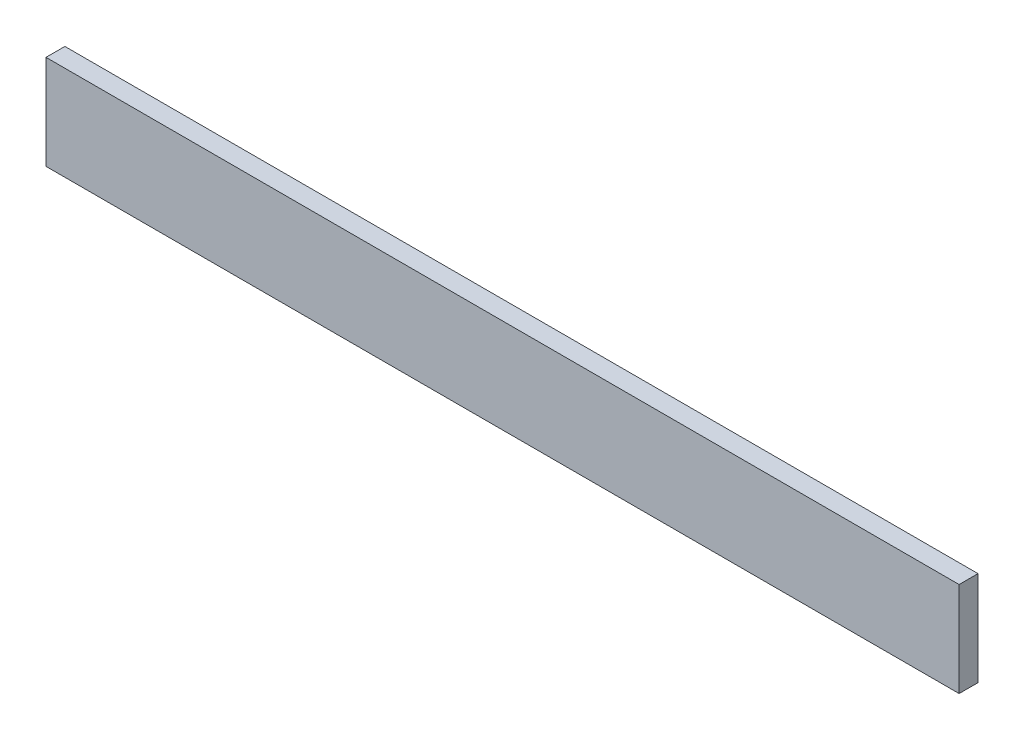
ISO-10303-21;
HEADER;
FILE_DESCRIPTION(('STEP AP214'),'2;1');
FILE_NAME('part.step','',(''),(''),'','','');
FILE_SCHEMA(('AUTOMOTIVE_DESIGN { 1 0 10303 214 1 1 1 1 }'));
ENDSEC;
DATA;
#1=APPLICATION_CONTEXT('core data for automotive mechanical design processes');
#2=APPLICATION_PROTOCOL_DEFINITION('international standard','automotive_design',2000,#1);
#3=PRODUCT_CONTEXT('',#1,'mechanical');
#4=PRODUCT('Part','Part','',(#3));
#5=PRODUCT_RELATED_PRODUCT_CATEGORY('part','',(#4));
#6=PRODUCT_DEFINITION_FORMATION('','',#4);
#7=PRODUCT_DEFINITION_CONTEXT('part definition',#1,'design');
#8=PRODUCT_DEFINITION('design','',#6,#7);
#9=PRODUCT_DEFINITION_SHAPE('','',#8);
#10=(LENGTH_UNIT() NAMED_UNIT(*) SI_UNIT(.MILLI.,.METRE.));
#11=(NAMED_UNIT(*) PLANE_ANGLE_UNIT() SI_UNIT($,.RADIAN.));
#12=(NAMED_UNIT(*) SI_UNIT($,.STERADIAN.) SOLID_ANGLE_UNIT());
#13=UNCERTAINTY_MEASURE_WITH_UNIT(LENGTH_MEASURE(1.E-05),#10,'distance_accuracy_value','');
#14=(GEOMETRIC_REPRESENTATION_CONTEXT(3) GLOBAL_UNCERTAINTY_ASSIGNED_CONTEXT((#13)) GLOBAL_UNIT_ASSIGNED_CONTEXT((#10,
#11,#12)) REPRESENTATION_CONTEXT('',''));
#15=CARTESIAN_POINT('',(0.,0.,0.));
#16=DIRECTION('',(0.,0.,1.));
#17=DIRECTION('',(1.,0.,0.));
#18=AXIS2_PLACEMENT_3D('',#15,#16,#17);
#19=CARTESIAN_POINT('',(39.6216819724826,39.0353646252086,118.017510674416));
#20=DIRECTION('',(-1.,0.,0.));
#21=DIRECTION('',(0.,0.,1.));
#22=AXIS2_PLACEMENT_3D('',#19,#20,#21);
#23=PLANE('',#22);
#24=DIRECTION('',(0.,-1.,0.));
#25=VECTOR('',#24,1.);
#26=CARTESIAN_POINT('',(39.6216819724826,39.0353646252086,120.017510674416));
#27=LINE('',#26,#25);
#28=CARTESIAN_POINT('',(39.6216819724826,39.0353646252086,120.017510674416));
#29=VERTEX_POINT('',#28);
#30=CARTESIAN_POINT('',(39.6216819724826,29.0353646252086,120.017510674416));
#31=VERTEX_POINT('',#30);
#32=EDGE_CURVE('E97',#29,#31,#27,.T.);
#33=ORIENTED_EDGE('',*,*,#32,.T.);
#34=DIRECTION('',(0.,0.,1.));
#35=VECTOR('',#34,1.);
#36=CARTESIAN_POINT('',(39.6216819724826,29.0353646252086,118.017510674416));
#37=LINE('',#36,#35);
#38=CARTESIAN_POINT('',(39.6216819724826,29.0353646252086,118.017510674416));
#39=VERTEX_POINT('',#38);
#40=EDGE_CURVE('E11',#39,#31,#37,.T.);
#41=ORIENTED_EDGE('',*,*,#40,.F.);
#42=DIRECTION('',(0.,-1.,0.));
#43=VECTOR('',#42,1.);
#44=CARTESIAN_POINT('',(39.6216819724826,39.0353646252086,118.017510674416));
#45=LINE('',#44,#43);
#46=CARTESIAN_POINT('',(39.6216819724826,39.0353646252086,118.017510674416));
#47=VERTEX_POINT('',#46);
#48=EDGE_CURVE('E85',#47,#39,#45,.T.);
#49=ORIENTED_EDGE('',*,*,#48,.F.);
#50=DIRECTION('',(0.,0.,1.));
#51=VECTOR('',#50,1.);
#52=CARTESIAN_POINT('',(39.6216819724826,39.0353646252086,118.017510674416));
#53=LINE('',#52,#51);
#54=EDGE_CURVE('E93',#47,#29,#53,.T.);
#55=ORIENTED_EDGE('',*,*,#54,.T.);
#56=EDGE_LOOP('',(#33,#41,#49,#55));
#57=FACE_BOUND('',#56,.T.);
#58=ADVANCED_FACE('F34',(#57),#23,.F.);
#59=CARTESIAN_POINT('',(39.6216819724826,29.0353646252086,118.017510674416));
#60=DIRECTION('',(0.,1.,0.));
#61=DIRECTION('',(0.,0.,1.));
#62=AXIS2_PLACEMENT_3D('',#59,#60,#61);
#63=PLANE('',#62);
#64=DIRECTION('',(-1.,0.,0.));
#65=VECTOR('',#64,1.);
#66=CARTESIAN_POINT('',(39.6216819724826,29.0353646252086,120.017510674416));
#67=LINE('',#66,#65);
#68=CARTESIAN_POINT('',(-57.0531592771973,29.0353646252086,120.017510674416));
#69=VERTEX_POINT('',#68);
#70=EDGE_CURVE('E89',#31,#69,#67,.T.);
#71=ORIENTED_EDGE('',*,*,#70,.T.);
#72=DIRECTION('',(0.,0.,1.));
#73=VECTOR('',#72,1.);
#74=CARTESIAN_POINT('',(-57.0531592771973,29.0353646252086,118.017510674416));
#75=LINE('',#74,#73);
#76=CARTESIAN_POINT('',(-57.0531592771973,29.0353646252086,118.017510674416));
#77=VERTEX_POINT('',#76);
#78=EDGE_CURVE('E42',#77,#69,#75,.T.);
#79=ORIENTED_EDGE('',*,*,#78,.F.);
#80=DIRECTION('',(-1.,0.,0.));
#81=VECTOR('',#80,1.);
#82=CARTESIAN_POINT('',(39.6216819724826,29.0353646252086,118.017510674416));
#83=LINE('',#82,#81);
#84=EDGE_CURVE('E80',#39,#77,#83,.T.);
#85=ORIENTED_EDGE('',*,*,#84,.F.);
#86=ORIENTED_EDGE('',*,*,#40,.T.);
#87=EDGE_LOOP('',(#71,#79,#85,#86));
#88=FACE_BOUND('',#87,.T.);
#89=ADVANCED_FACE('F88',(#88),#63,.F.);
#90=CARTESIAN_POINT('',(-57.0531592771973,39.0353646252086,118.017510674416));
#91=DIRECTION('',(1.,0.,0.));
#92=DIRECTION('',(0.,0.,-1.));
#93=AXIS2_PLACEMENT_3D('',#90,#91,#92);
#94=PLANE('',#93);
#95=DIRECTION('',(0.,1.,0.));
#96=VECTOR('',#95,1.);
#97=CARTESIAN_POINT('',(-57.0531592771973,39.0353646252086,120.017510674416));
#98=LINE('',#97,#96);
#99=CARTESIAN_POINT('',(-57.0531592771973,39.0353646252086,120.017510674416));
#100=VERTEX_POINT('',#99);
#101=EDGE_CURVE('E67',#69,#100,#98,.T.);
#102=ORIENTED_EDGE('',*,*,#101,.T.);
#103=DIRECTION('',(0.,0.,1.));
#104=VECTOR('',#103,1.);
#105=CARTESIAN_POINT('',(-57.0531592771973,39.0353646252086,118.017510674416));
#106=LINE('',#105,#104);
#107=CARTESIAN_POINT('',(-57.0531592771973,39.0353646252086,118.017510674416));
#108=VERTEX_POINT('',#107);
#109=EDGE_CURVE('E90',#108,#100,#106,.T.);
#110=ORIENTED_EDGE('',*,*,#109,.F.);
#111=DIRECTION('',(0.,1.,0.));
#112=VECTOR('',#111,1.);
#113=CARTESIAN_POINT('',(-57.0531592771973,39.0353646252086,118.017510674416));
#114=LINE('',#113,#112);
#115=EDGE_CURVE('E83',#77,#108,#114,.T.);
#116=ORIENTED_EDGE('',*,*,#115,.F.);
#117=ORIENTED_EDGE('',*,*,#78,.T.);
#118=EDGE_LOOP('',(#102,#110,#116,#117));
#119=FACE_BOUND('',#118,.T.);
#120=ADVANCED_FACE('F91',(#119),#94,.F.);
#121=CARTESIAN_POINT('',(39.6216819724826,39.0353646252086,118.017510674416));
#122=DIRECTION('',(0.,-1.,0.));
#123=DIRECTION('',(0.,0.,-1.));
#124=AXIS2_PLACEMENT_3D('',#121,#122,#123);
#125=PLANE('',#124);
#126=DIRECTION('',(1.,0.,0.));
#127=VECTOR('',#126,1.);
#128=CARTESIAN_POINT('',(39.6216819724826,39.0353646252086,120.017510674416));
#129=LINE('',#128,#127);
#130=EDGE_CURVE('E73',#100,#29,#129,.T.);
#131=ORIENTED_EDGE('',*,*,#130,.T.);
#132=ORIENTED_EDGE('',*,*,#54,.F.);
#133=DIRECTION('',(1.,0.,0.));
#134=VECTOR('',#133,1.);
#135=CARTESIAN_POINT('',(39.6216819724826,39.0353646252086,118.017510674416));
#136=LINE('',#135,#134);
#137=EDGE_CURVE('E50',#108,#47,#136,.T.);
#138=ORIENTED_EDGE('',*,*,#137,.F.);
#139=ORIENTED_EDGE('',*,*,#109,.T.);
#140=EDGE_LOOP('',(#131,#132,#138,#139));
#141=FACE_BOUND('',#140,.T.);
#142=ADVANCED_FACE('F104',(#141),#125,.F.);
#143=CARTESIAN_POINT('',(0.,0.,118.017510674416));
#144=DIRECTION('',(0.,0.,-1.));
#145=DIRECTION('',(-1.,0.,0.));
#146=AXIS2_PLACEMENT_3D('',#143,#144,#145);
#147=PLANE('',#146);
#148=ORIENTED_EDGE('',*,*,#48,.T.);
#149=ORIENTED_EDGE('',*,*,#84,.T.);
#150=ORIENTED_EDGE('',*,*,#115,.T.);
#151=ORIENTED_EDGE('',*,*,#137,.T.);
#152=EDGE_LOOP('',(#148,#149,#150,#151));
#153=FACE_BOUND('',#152,.T.);
#154=ADVANCED_FACE('F81',(#153),#147,.T.);
#155=CARTESIAN_POINT('',(0.,0.,120.017510674416));
#156=DIRECTION('',(0.,0.,-1.));
#157=DIRECTION('',(-1.,0.,0.));
#158=AXIS2_PLACEMENT_3D('',#155,#156,#157);
#159=PLANE('',#158);
#160=ORIENTED_EDGE('',*,*,#32,.F.);
#161=ORIENTED_EDGE('',*,*,#130,.F.);
#162=ORIENTED_EDGE('',*,*,#101,.F.);
#163=ORIENTED_EDGE('',*,*,#70,.F.);
#164=EDGE_LOOP('',(#160,#161,#162,#163));
#165=FACE_BOUND('',#164,.T.);
#166=ADVANCED_FACE('F107',(#165),#159,.F.);
#167=CLOSED_SHELL('',(#58,#89,#120,#142,#154,#166));
#168=MANIFOLD_SOLID_BREP('B2',#167);
#169=ADVANCED_BREP_SHAPE_REPRESENTATION('',(#18,#168),#14);
#170=SHAPE_DEFINITION_REPRESENTATION(#9,#169);
ENDSEC;
END-ISO-10303-21;
